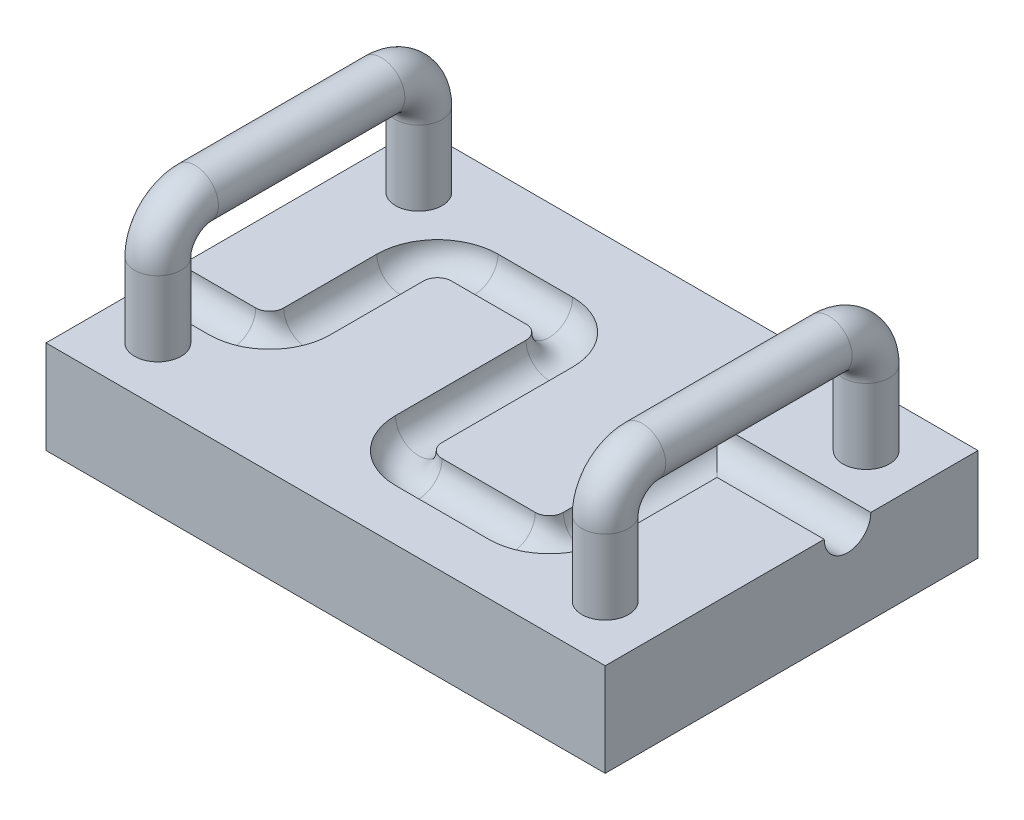
ISO-10303-21;
HEADER;
FILE_DESCRIPTION(('STEP AP214'),'2;1');
FILE_NAME('part.step','',(''),(''),'','','');
FILE_SCHEMA(('AUTOMOTIVE_DESIGN { 1 0 10303 214 1 1 1 1 }'));
ENDSEC;
DATA;
#1=APPLICATION_CONTEXT('core data for automotive mechanical design processes');
#2=APPLICATION_PROTOCOL_DEFINITION('international standard','automotive_design',2000,#1);
#3=PRODUCT_CONTEXT('',#1,'mechanical');
#4=PRODUCT('Part','Part','',(#3));
#5=PRODUCT_RELATED_PRODUCT_CATEGORY('part','',(#4));
#6=PRODUCT_DEFINITION_FORMATION('','',#4);
#7=PRODUCT_DEFINITION_CONTEXT('part definition',#1,'design');
#8=PRODUCT_DEFINITION('design','',#6,#7);
#9=PRODUCT_DEFINITION_SHAPE('','',#8);
#10=(LENGTH_UNIT() NAMED_UNIT(*) SI_UNIT(.MILLI.,.METRE.));
#11=(NAMED_UNIT(*) PLANE_ANGLE_UNIT() SI_UNIT($,.RADIAN.));
#12=(NAMED_UNIT(*) SI_UNIT($,.STERADIAN.) SOLID_ANGLE_UNIT());
#13=UNCERTAINTY_MEASURE_WITH_UNIT(LENGTH_MEASURE(1.E-05),#10,'distance_accuracy_value','');
#14=(GEOMETRIC_REPRESENTATION_CONTEXT(3) GLOBAL_UNCERTAINTY_ASSIGNED_CONTEXT((#13)) GLOBAL_UNIT_ASSIGNED_CONTEXT((#10,
#11,#12)) REPRESENTATION_CONTEXT('',''));
#15=CARTESIAN_POINT('',(0.,0.,0.));
#16=DIRECTION('',(0.,0.,1.));
#17=DIRECTION('',(1.,0.,0.));
#18=AXIS2_PLACEMENT_3D('',#15,#16,#17);
#19=CARTESIAN_POINT('',(0.,0.,0.));
#20=DIRECTION('',(0.,1.,0.));
#21=DIRECTION('',(0.,0.,1.));
#22=AXIS2_PLACEMENT_3D('',#19,#20,#21);
#23=PLANE('',#22);
#24=CARTESIAN_POINT('',(120.,0.,70.));
#25=DIRECTION('',(0.,-1.,0.));
#26=DIRECTION('',(0.,0.,1.));
#27=AXIS2_PLACEMENT_3D('',#24,#25,#26);
#28=CIRCLE('',#27,12.5);
#29=CARTESIAN_POINT('',(120.,0.,82.5));
#30=VERTEX_POINT('',#29);
#31=EDGE_CURVE('E653',#30,#30,#28,.F.);
#32=ORIENTED_EDGE('',*,*,#31,.F.);
#33=EDGE_LOOP('',(#32));
#34=FACE_BOUND('',#33,.T.);
#35=CARTESIAN_POINT('',(-120.,0.,70.));
#36=DIRECTION('',(0.,1.,0.));
#37=DIRECTION('',(0.,0.,1.));
#38=AXIS2_PLACEMENT_3D('',#35,#36,#37);
#39=CIRCLE('',#38,12.5);
#40=CARTESIAN_POINT('',(-120.,0.,82.5));
#41=VERTEX_POINT('',#40);
#42=EDGE_CURVE('E309',#41,#41,#39,.T.);
#43=ORIENTED_EDGE('',*,*,#42,.F.);
#44=EDGE_LOOP('',(#43));
#45=FACE_BOUND('',#44,.T.);
#46=CARTESIAN_POINT('',(-110.,0.,20.0000000000001));
#47=DIRECTION('',(0.,1.,0.));
#48=DIRECTION('',(0.,0.,1.));
#49=AXIS2_PLACEMENT_3D('',#46,#47,#48);
#50=CIRCLE('',#49,32.4999999999988);
#51=CARTESIAN_POINT('',(-77.5,0.,19.9999999999998));
#52=VERTEX_POINT('',#51);
#53=CARTESIAN_POINT('',(-110.,0.,52.4999999999995));
#54=VERTEX_POINT('',#53);
#55=EDGE_CURVE('E211',#52,#54,#50,.F.);
#56=ORIENTED_EDGE('',*,*,#55,.T.);
#57=DIRECTION('',(1.,0.,0.));
#58=VECTOR('',#57,1.);
#59=CARTESIAN_POINT('',(-151.,0.,52.5000000000001));
#60=LINE('',#59,#58);
#61=CARTESIAN_POINT('',(-150.,0.,52.5000000000001));
#62=VERTEX_POINT('',#61);
#63=EDGE_CURVE('E12',#54,#62,#60,.F.);
#64=ORIENTED_EDGE('',*,*,#63,.T.);
#65=DIRECTION('',(0.,0.,1.));
#66=VECTOR('',#65,1.);
#67=CARTESIAN_POINT('',(-150.,0.,100.));
#68=LINE('',#67,#66);
#69=CARTESIAN_POINT('',(-150.,0.,100.));
#70=VERTEX_POINT('',#69);
#71=EDGE_CURVE('E204',#62,#70,#68,.T.);
#72=ORIENTED_EDGE('',*,*,#71,.T.);
#73=DIRECTION('',(1.,0.,0.));
#74=VECTOR('',#73,1.);
#75=CARTESIAN_POINT('',(150.,0.,100.));
#76=LINE('',#75,#74);
#77=CARTESIAN_POINT('',(150.,0.,100.));
#78=VERTEX_POINT('',#77);
#79=EDGE_CURVE('E214',#70,#78,#76,.T.);
#80=ORIENTED_EDGE('',*,*,#79,.T.);
#81=DIRECTION('',(0.,0.,-1.));
#82=VECTOR('',#81,1.);
#83=CARTESIAN_POINT('',(150.,0.,100.));
#84=LINE('',#83,#82);
#85=CARTESIAN_POINT('',(150.,0.,-17.4999999999999));
#86=VERTEX_POINT('',#85);
#87=EDGE_CURVE('E221',#78,#86,#84,.T.);
#88=ORIENTED_EDGE('',*,*,#87,.T.);
#89=DIRECTION('',(1.,0.,0.));
#90=VECTOR('',#89,1.);
#91=CARTESIAN_POINT('',(66.15,0.,-17.4999999999999));
#92=LINE('',#91,#90);
#93=CARTESIAN_POINT('',(92.5,0.,-17.4999999999999));
#94=VERTEX_POINT('',#93);
#95=EDGE_CURVE('E76',#86,#94,#92,.F.);
#96=ORIENTED_EDGE('',*,*,#95,.T.);
#97=DIRECTION('',(0.,0.,-1.));
#98=VECTOR('',#97,1.);
#99=CARTESIAN_POINT('',(92.5,0.,39.9999999999999));
#100=LINE('',#99,#98);
#101=CARTESIAN_POINT('',(92.5,0.,39.9999999999999));
#102=VERTEX_POINT('',#101);
#103=EDGE_CURVE('E269',#94,#102,#100,.F.);
#104=ORIENTED_EDGE('',*,*,#103,.T.);
#105=CARTESIAN_POINT('',(60.,0.,40.0000000000001));
#106=DIRECTION('',(0.,1.,0.));
#107=DIRECTION('',(0.,0.,1.));
#108=AXIS2_PLACEMENT_3D('',#105,#106,#107);
#109=CIRCLE('',#108,32.499999999999);
#110=CARTESIAN_POINT('',(59.9999999999999,0.,72.4999999999996));
#111=VERTEX_POINT('',#110);
#112=EDGE_CURVE('E272',#102,#111,#109,.F.);
#113=ORIENTED_EDGE('',*,*,#112,.T.);
#114=DIRECTION('',(1.,0.,0.));
#115=VECTOR('',#114,1.);
#116=CARTESIAN_POINT('',(10.,0.,72.5000000000001));
#117=LINE('',#116,#115);
#118=CARTESIAN_POINT('',(10.,0.,72.5000000000001));
#119=VERTEX_POINT('',#118);
#120=EDGE_CURVE('E275',#111,#119,#117,.F.);
#121=ORIENTED_EDGE('',*,*,#120,.T.);
#122=CARTESIAN_POINT('',(10.,0.,40.));
#123=DIRECTION('',(0.,1.,0.));
#124=DIRECTION('',(0.,0.,1.));
#125=AXIS2_PLACEMENT_3D('',#122,#123,#124);
#126=CIRCLE('',#125,32.5);
#127=CARTESIAN_POINT('',(-22.5,0.,39.9999999999999));
#128=VERTEX_POINT('',#127);
#129=EDGE_CURVE('E278',#119,#128,#126,.F.);
#130=ORIENTED_EDGE('',*,*,#129,.T.);
#131=DIRECTION('',(0.,0.,1.));
#132=VECTOR('',#131,1.);
#133=CARTESIAN_POINT('',(-22.5,0.,-29.9999999999998));
#134=LINE('',#133,#132);
#135=CARTESIAN_POINT('',(-22.5,0.,-29.9999999999999));
#136=VERTEX_POINT('',#135);
#137=EDGE_CURVE('E281',#128,#136,#134,.F.);
#138=ORIENTED_EDGE('',*,*,#137,.T.);
#139=CARTESIAN_POINT('',(-30.,0.,-29.9999999999999));
#140=DIRECTION('',(0.,-1.,0.));
#141=DIRECTION('',(0.,0.,-1.));
#142=AXIS2_PLACEMENT_3D('',#139,#140,#141);
#143=CIRCLE('',#142,7.4999999999989);
#144=CARTESIAN_POINT('',(-30.0000000000001,0.,-37.4999999999999));
#145=VERTEX_POINT('',#144);
#146=EDGE_CURVE('E284',#136,#145,#143,.F.);
#147=ORIENTED_EDGE('',*,*,#146,.T.);
#148=DIRECTION('',(1.,0.,0.));
#149=VECTOR('',#148,1.);
#150=CARTESIAN_POINT('',(-70.,0.,-37.4999999999999));
#151=LINE('',#150,#149);
#152=CARTESIAN_POINT('',(-70.,0.,-37.4999999999999));
#153=VERTEX_POINT('',#152);
#154=EDGE_CURVE('E287',#145,#153,#151,.F.);
#155=ORIENTED_EDGE('',*,*,#154,.T.);
#156=CARTESIAN_POINT('',(-70.,0.,-30.));
#157=DIRECTION('',(0.,-1.,0.));
#158=DIRECTION('',(0.,0.,-1.));
#159=AXIS2_PLACEMENT_3D('',#156,#157,#158);
#160=CIRCLE('',#159,7.5);
#161=CARTESIAN_POINT('',(-77.5,0.,-29.9999999999998));
#162=VERTEX_POINT('',#161);
#163=EDGE_CURVE('E290',#153,#162,#160,.F.);
#164=ORIENTED_EDGE('',*,*,#163,.T.);
#165=DIRECTION('',(0.,0.,-1.));
#166=VECTOR('',#165,1.);
#167=CARTESIAN_POINT('',(-77.5,0.,19.9999999999999));
#168=LINE('',#167,#166);
#169=EDGE_CURVE('E293',#162,#52,#168,.F.);
#170=ORIENTED_EDGE('',*,*,#169,.T.);
#171=EDGE_LOOP('',(#56,#64,#72,#80,#88,#96,#104,#113,#121,#130,#138,#147,#155,#164,#170));
#172=FACE_BOUND('',#171,.T.);
#173=ADVANCED_FACE('F68',(#34,#45,#172),#23,.T.);
#174=CARTESIAN_POINT('',(120.,0.,-70.));
#175=DIRECTION('',(0.,1.,0.));
#176=DIRECTION('',(0.,0.,-1.));
#177=AXIS2_PLACEMENT_3D('',#174,#175,#176);
#178=CIRCLE('',#177,12.5);
#179=CARTESIAN_POINT('',(120.,0.,-82.5));
#180=VERTEX_POINT('',#179);
#181=EDGE_CURVE('E667',#180,#180,#178,.F.);
#182=ORIENTED_EDGE('',*,*,#181,.T.);
#183=EDGE_LOOP('',(#182));
#184=FACE_BOUND('',#183,.T.);
#185=CARTESIAN_POINT('',(-120.,0.,-70.));
#186=DIRECTION('',(0.,-1.,0.));
#187=DIRECTION('',(0.,0.,-1.));
#188=AXIS2_PLACEMENT_3D('',#185,#186,#187);
#189=CIRCLE('',#188,12.5);
#190=CARTESIAN_POINT('',(-120.,0.,-82.5));
#191=VERTEX_POINT('',#190);
#192=EDGE_CURVE('E650',#191,#191,#189,.T.);
#193=ORIENTED_EDGE('',*,*,#192,.T.);
#194=EDGE_LOOP('',(#193));
#195=FACE_BOUND('',#194,.T.);
#196=CARTESIAN_POINT('',(-150.,0.,-100.));
#197=VERTEX_POINT('',#196);
#198=CARTESIAN_POINT('',(-150.,0.,27.5000000000001));
#199=VERTEX_POINT('',#198);
#200=EDGE_CURVE('E212',#197,#199,#68,.T.);
#201=ORIENTED_EDGE('',*,*,#200,.T.);
#202=DIRECTION('',(1.,0.,0.));
#203=VECTOR('',#202,1.);
#204=CARTESIAN_POINT('',(-151.,0.,27.5000000000001));
#205=LINE('',#204,#203);
#206=CARTESIAN_POINT('',(-110.,0.,27.5000000000001));
#207=VERTEX_POINT('',#206);
#208=EDGE_CURVE('E201',#199,#207,#205,.T.);
#209=ORIENTED_EDGE('',*,*,#208,.T.);
#210=CARTESIAN_POINT('',(-110.,0.,20.0000000000001));
#211=DIRECTION('',(0.,-1.,0.));
#212=DIRECTION('',(0.,0.,-1.));
#213=AXIS2_PLACEMENT_3D('',#210,#211,#212);
#214=CIRCLE('',#213,7.49999999999878);
#215=CARTESIAN_POINT('',(-102.5,0.,20.));
#216=VERTEX_POINT('',#215);
#217=EDGE_CURVE('E262',#207,#216,#214,.F.);
#218=ORIENTED_EDGE('',*,*,#217,.T.);
#219=DIRECTION('',(0.,0.,-1.));
#220=VECTOR('',#219,1.);
#221=CARTESIAN_POINT('',(-102.5,0.,19.9999999999999));
#222=LINE('',#221,#220);
#223=CARTESIAN_POINT('',(-102.5,0.,-29.9999999999998));
#224=VERTEX_POINT('',#223);
#225=EDGE_CURVE('E259',#216,#224,#222,.T.);
#226=ORIENTED_EDGE('',*,*,#225,.T.);
#227=CARTESIAN_POINT('',(-70.,0.,-30.));
#228=DIRECTION('',(0.,1.,0.));
#229=DIRECTION('',(0.,0.,1.));
#230=AXIS2_PLACEMENT_3D('',#227,#228,#229);
#231=CIRCLE('',#230,32.5);
#232=CARTESIAN_POINT('',(-70.,0.,-62.4999999999999));
#233=VERTEX_POINT('',#232);
#234=EDGE_CURVE('E256',#224,#233,#231,.F.);
#235=ORIENTED_EDGE('',*,*,#234,.T.);
#236=DIRECTION('',(1.,0.,0.));
#237=VECTOR('',#236,1.);
#238=CARTESIAN_POINT('',(-70.,0.,-62.4999999999999));
#239=LINE('',#238,#237);
#240=CARTESIAN_POINT('',(-30.0000000000001,0.,-62.4999999999994));
#241=VERTEX_POINT('',#240);
#242=EDGE_CURVE('E253',#233,#241,#239,.T.);
#243=ORIENTED_EDGE('',*,*,#242,.T.);
#244=CARTESIAN_POINT('',(-30.,0.,-29.9999999999999));
#245=DIRECTION('',(0.,1.,0.));
#246=DIRECTION('',(0.,0.,1.));
#247=AXIS2_PLACEMENT_3D('',#244,#245,#246);
#248=CIRCLE('',#247,32.4999999999989);
#249=CARTESIAN_POINT('',(2.5,0.,-29.9999999999997));
#250=VERTEX_POINT('',#249);
#251=EDGE_CURVE('E250',#241,#250,#248,.F.);
#252=ORIENTED_EDGE('',*,*,#251,.T.);
#253=DIRECTION('',(0.,0.,1.));
#254=VECTOR('',#253,1.);
#255=CARTESIAN_POINT('',(2.50000000000001,0.,-29.9999999999998));
#256=LINE('',#255,#254);
#257=CARTESIAN_POINT('',(2.50000000000001,0.,39.9999999999999));
#258=VERTEX_POINT('',#257);
#259=EDGE_CURVE('E247',#250,#258,#256,.T.);
#260=ORIENTED_EDGE('',*,*,#259,.T.);
#261=CARTESIAN_POINT('',(10.,0.,40.));
#262=DIRECTION('',(0.,-1.,0.));
#263=DIRECTION('',(0.,0.,-1.));
#264=AXIS2_PLACEMENT_3D('',#261,#262,#263);
#265=CIRCLE('',#264,7.5);
#266=CARTESIAN_POINT('',(10.,0.,47.5000000000001));
#267=VERTEX_POINT('',#266);
#268=EDGE_CURVE('E244',#258,#267,#265,.F.);
#269=ORIENTED_EDGE('',*,*,#268,.T.);
#270=DIRECTION('',(1.,0.,0.));
#271=VECTOR('',#270,1.);
#272=CARTESIAN_POINT('',(10.,0.,47.5000000000001));
#273=LINE('',#272,#271);
#274=CARTESIAN_POINT('',(59.9999999999999,0.,47.5000000000001));
#275=VERTEX_POINT('',#274);
#276=EDGE_CURVE('E241',#267,#275,#273,.T.);
#277=ORIENTED_EDGE('',*,*,#276,.T.);
#278=CARTESIAN_POINT('',(60.,0.,40.0000000000001));
#279=DIRECTION('',(0.,-1.,0.));
#280=DIRECTION('',(0.,0.,-1.));
#281=AXIS2_PLACEMENT_3D('',#278,#279,#280);
#282=CIRCLE('',#281,7.49999999999898);
#283=CARTESIAN_POINT('',(67.5,0.,40.));
#284=VERTEX_POINT('',#283);
#285=EDGE_CURVE('E238',#275,#284,#282,.F.);
#286=ORIENTED_EDGE('',*,*,#285,.T.);
#287=DIRECTION('',(0.,0.,-1.));
#288=VECTOR('',#287,1.);
#289=CARTESIAN_POINT('',(67.5,0.,39.9999999999999));
#290=LINE('',#289,#288);
#291=CARTESIAN_POINT('',(67.5,0.,-42.5));
#292=VERTEX_POINT('',#291);
#293=EDGE_CURVE('E229',#284,#292,#290,.T.);
#294=ORIENTED_EDGE('',*,*,#293,.T.);
#295=DIRECTION('',(1.,0.,0.));
#296=VECTOR('',#295,1.);
#297=CARTESIAN_POINT('',(66.15,0.,-42.5));
#298=LINE('',#297,#296);
#299=CARTESIAN_POINT('',(150.,0.,-42.4999999999999));
#300=VERTEX_POINT('',#299);
#301=EDGE_CURVE('E265',#292,#300,#298,.T.);
#302=ORIENTED_EDGE('',*,*,#301,.T.);
#303=CARTESIAN_POINT('',(150.,0.,-100.));
#304=VERTEX_POINT('',#303);
#305=EDGE_CURVE('E220',#300,#304,#84,.T.);
#306=ORIENTED_EDGE('',*,*,#305,.T.);
#307=DIRECTION('',(-1.,0.,0.));
#308=VECTOR('',#307,1.);
#309=CARTESIAN_POINT('',(150.,0.,-100.));
#310=LINE('',#309,#308);
#311=EDGE_CURVE('E224',#304,#197,#310,.T.);
#312=ORIENTED_EDGE('',*,*,#311,.T.);
#313=EDGE_LOOP('',(#201,#209,#218,#226,#235,#243,#252,#260,#269,#277,#286,#294,#302,#306,#312));
#314=FACE_BOUND('',#313,.T.);
#315=ADVANCED_FACE('F356',(#184,#195,#314),#23,.T.);
#316=CARTESIAN_POINT('',(-150.,-50.,100.));
#317=DIRECTION('',(-1.,0.,0.));
#318=DIRECTION('',(0.,0.,1.));
#319=AXIS2_PLACEMENT_3D('',#316,#317,#318);
#320=PLANE('',#319);
#321=ORIENTED_EDGE('',*,*,#71,.F.);
#322=CARTESIAN_POINT('',(-150.,0.,40.0000000000001));
#323=DIRECTION('',(-1.,0.,0.));
#324=DIRECTION('',(0.,0.,1.));
#325=AXIS2_PLACEMENT_3D('',#322,#323,#324);
#326=CIRCLE('',#325,12.5);
#327=EDGE_CURVE('E196',#199,#62,#326,.T.);
#328=ORIENTED_EDGE('',*,*,#327,.F.);
#329=ORIENTED_EDGE('',*,*,#200,.F.);
#330=DIRECTION('',(0.,1.,0.));
#331=VECTOR('',#330,1.);
#332=CARTESIAN_POINT('',(-150.,-50.,-100.));
#333=LINE('',#332,#331);
#334=CARTESIAN_POINT('',(-150.,-50.,-100.));
#335=VERTEX_POINT('',#334);
#336=EDGE_CURVE('E92',#335,#197,#333,.T.);
#337=ORIENTED_EDGE('',*,*,#336,.F.);
#338=DIRECTION('',(0.,0.,1.));
#339=VECTOR('',#338,1.);
#340=CARTESIAN_POINT('',(-150.,-50.,100.));
#341=LINE('',#340,#339);
#342=CARTESIAN_POINT('',(-150.,-50.,100.));
#343=VERTEX_POINT('',#342);
#344=EDGE_CURVE('E227',#335,#343,#341,.T.);
#345=ORIENTED_EDGE('',*,*,#344,.T.);
#346=DIRECTION('',(0.,1.,0.));
#347=VECTOR('',#346,1.);
#348=CARTESIAN_POINT('',(-150.,-50.,100.));
#349=LINE('',#348,#347);
#350=EDGE_CURVE('E119',#343,#70,#349,.T.);
#351=ORIENTED_EDGE('',*,*,#350,.T.);
#352=EDGE_LOOP('',(#321,#328,#329,#337,#345,#351));
#353=FACE_BOUND('',#352,.T.);
#354=ADVANCED_FACE('F70',(#353),#320,.T.);
#355=CARTESIAN_POINT('',(150.,-50.,-100.));
#356=DIRECTION('',(0.,0.,-1.));
#357=DIRECTION('',(-1.,0.,0.));
#358=AXIS2_PLACEMENT_3D('',#355,#356,#357);
#359=PLANE('',#358);
#360=ORIENTED_EDGE('',*,*,#311,.F.);
#361=DIRECTION('',(0.,1.,0.));
#362=VECTOR('',#361,1.);
#363=CARTESIAN_POINT('',(150.,-50.,-100.));
#364=LINE('',#363,#362);
#365=CARTESIAN_POINT('',(150.,-50.,-100.));
#366=VERTEX_POINT('',#365);
#367=EDGE_CURVE('E230',#366,#304,#364,.T.);
#368=ORIENTED_EDGE('',*,*,#367,.F.);
#369=DIRECTION('',(-1.,0.,0.));
#370=VECTOR('',#369,1.);
#371=CARTESIAN_POINT('',(150.,-50.,-100.));
#372=LINE('',#371,#370);
#373=EDGE_CURVE('E217',#366,#335,#372,.T.);
#374=ORIENTED_EDGE('',*,*,#373,.T.);
#375=ORIENTED_EDGE('',*,*,#336,.T.);
#376=EDGE_LOOP('',(#360,#368,#374,#375));
#377=FACE_BOUND('',#376,.T.);
#378=ADVANCED_FACE('F344',(#377),#359,.T.);
#379=CARTESIAN_POINT('',(150.,-50.,100.));
#380=DIRECTION('',(1.,0.,0.));
#381=DIRECTION('',(0.,0.,-1.));
#382=AXIS2_PLACEMENT_3D('',#379,#380,#381);
#383=PLANE('',#382);
#384=ORIENTED_EDGE('',*,*,#305,.F.);
#385=CARTESIAN_POINT('',(150.,0.,-29.9999999999999));
#386=DIRECTION('',(1.,0.,0.));
#387=DIRECTION('',(0.,0.,-1.));
#388=AXIS2_PLACEMENT_3D('',#385,#386,#387);
#389=CIRCLE('',#388,12.5);
#390=EDGE_CURVE('E205',#86,#300,#389,.T.);
#391=ORIENTED_EDGE('',*,*,#390,.F.);
#392=ORIENTED_EDGE('',*,*,#87,.F.);
#393=DIRECTION('',(0.,1.,0.));
#394=VECTOR('',#393,1.);
#395=CARTESIAN_POINT('',(150.,-50.,100.));
#396=LINE('',#395,#394);
#397=CARTESIAN_POINT('',(150.,-50.,100.));
#398=VERTEX_POINT('',#397);
#399=EDGE_CURVE('E233',#398,#78,#396,.T.);
#400=ORIENTED_EDGE('',*,*,#399,.F.);
#401=DIRECTION('',(0.,0.,-1.));
#402=VECTOR('',#401,1.);
#403=CARTESIAN_POINT('',(150.,-50.,100.));
#404=LINE('',#403,#402);
#405=EDGE_CURVE('E340',#398,#366,#404,.T.);
#406=ORIENTED_EDGE('',*,*,#405,.T.);
#407=ORIENTED_EDGE('',*,*,#367,.T.);
#408=EDGE_LOOP('',(#384,#391,#392,#400,#406,#407));
#409=FACE_BOUND('',#408,.T.);
#410=ADVANCED_FACE('F302',(#409),#383,.T.);
#411=CARTESIAN_POINT('',(150.,-50.,100.));
#412=DIRECTION('',(0.,0.,1.));
#413=DIRECTION('',(1.,0.,0.));
#414=AXIS2_PLACEMENT_3D('',#411,#412,#413);
#415=PLANE('',#414);
#416=ORIENTED_EDGE('',*,*,#79,.F.);
#417=ORIENTED_EDGE('',*,*,#350,.F.);
#418=DIRECTION('',(1.,0.,0.));
#419=VECTOR('',#418,1.);
#420=CARTESIAN_POINT('',(150.,-50.,100.));
#421=LINE('',#420,#419);
#422=EDGE_CURVE('E339',#343,#398,#421,.T.);
#423=ORIENTED_EDGE('',*,*,#422,.T.);
#424=ORIENTED_EDGE('',*,*,#399,.T.);
#425=EDGE_LOOP('',(#416,#417,#423,#424));
#426=FACE_BOUND('',#425,.T.);
#427=ADVANCED_FACE('F347',(#426),#415,.T.);
#428=CARTESIAN_POINT('',(0.,-50.,0.));
#429=DIRECTION('',(0.,1.,0.));
#430=DIRECTION('',(0.,0.,1.));
#431=AXIS2_PLACEMENT_3D('',#428,#429,#430);
#432=PLANE('',#431);
#433=ORIENTED_EDGE('',*,*,#344,.F.);
#434=ORIENTED_EDGE('',*,*,#373,.F.);
#435=ORIENTED_EDGE('',*,*,#405,.F.);
#436=ORIENTED_EDGE('',*,*,#422,.F.);
#437=EDGE_LOOP('',(#433,#434,#435,#436));
#438=FACE_BOUND('',#437,.T.);
#439=ADVANCED_FACE('F346',(#438),#432,.F.);
#440=CARTESIAN_POINT('',(-151.,0.,40.0000000000001));
#441=DIRECTION('',(1.,0.,0.));
#442=DIRECTION('',(0.,0.,-1.));
#443=AXIS2_PLACEMENT_3D('',#440,#441,#442);
#444=CYLINDRICAL_SURFACE('',#443,12.5);
#445=CARTESIAN_POINT('',(-110.,0.,40.0000000000001));
#446=DIRECTION('',(-1.,0.,0.));
#447=DIRECTION('',(0.,0.,1.));
#448=AXIS2_PLACEMENT_3D('',#445,#446,#447);
#449=CIRCLE('',#448,12.5);
#450=EDGE_CURVE('E335',#207,#54,#449,.T.);
#451=ORIENTED_EDGE('',*,*,#450,.F.);
#452=ORIENTED_EDGE('',*,*,#208,.F.);
#453=ORIENTED_EDGE('',*,*,#327,.T.);
#454=ORIENTED_EDGE('',*,*,#63,.F.);
#455=EDGE_LOOP('',(#451,#452,#453,#454));
#456=FACE_BOUND('',#455,.T.);
#457=ADVANCED_FACE('F198',(#456),#444,.F.);
#458=CARTESIAN_POINT('',(66.15,0.,-29.9999999999999));
#459=DIRECTION('',(1.,0.,0.));
#460=DIRECTION('',(0.,0.,-1.));
#461=AXIS2_PLACEMENT_3D('',#458,#459,#460);
#462=CYLINDRICAL_SURFACE('',#461,12.5);
#463=ORIENTED_EDGE('',*,*,#390,.T.);
#464=ORIENTED_EDGE('',*,*,#301,.F.);
#465=CARTESIAN_POINT('',(80.,0.,-29.9999999999999));
#466=DIRECTION('',(0.707106781186548,0.,-0.707106781186547));
#467=DIRECTION('',(-0.707106781186547,0.,-0.707106781186548));
#468=AXIS2_PLACEMENT_3D('',#465,#466,#467);
#469=ELLIPSE('',#468,17.6776695296637,12.5);
#470=EDGE_CURVE('E83',#94,#292,#469,.T.);
#471=ORIENTED_EDGE('',*,*,#470,.F.);
#472=ORIENTED_EDGE('',*,*,#95,.F.);
#473=EDGE_LOOP('',(#463,#464,#471,#472));
#474=FACE_BOUND('',#473,.T.);
#475=ADVANCED_FACE('F299',(#474),#462,.F.);
#476=CARTESIAN_POINT('',(-110.,0.,20.0000000000001));
#477=DIRECTION('',(0.,1.,0.));
#478=DIRECTION('',(0.,0.,1.));
#479=AXIS2_PLACEMENT_3D('',#476,#477,#478);
#480=TOROIDAL_SURFACE('',#479,19.9999999999988,12.5);
#481=CARTESIAN_POINT('',(-90.,0.,19.9999999999999));
#482=DIRECTION('',(0.,0.,1.));
#483=DIRECTION('',(1.,0.,0.));
#484=AXIS2_PLACEMENT_3D('',#481,#482,#483);
#485=CIRCLE('',#484,12.5);
#486=EDGE_CURVE('E332',#216,#52,#485,.T.);
#487=ORIENTED_EDGE('',*,*,#486,.F.);
#488=ORIENTED_EDGE('',*,*,#217,.F.);
#489=ORIENTED_EDGE('',*,*,#450,.T.);
#490=ORIENTED_EDGE('',*,*,#55,.F.);
#491=EDGE_LOOP('',(#487,#488,#489,#490));
#492=FACE_BOUND('',#491,.T.);
#493=ADVANCED_FACE('F469',(#492),#480,.F.);
#494=CARTESIAN_POINT('',(-90.,0.,19.9999999999999));
#495=DIRECTION('',(0.,0.,-1.));
#496=DIRECTION('',(-1.,0.,0.));
#497=AXIS2_PLACEMENT_3D('',#494,#495,#496);
#498=CYLINDRICAL_SURFACE('',#497,12.5);
#499=CARTESIAN_POINT('',(-90.,0.,-29.9999999999998));
#500=DIRECTION('',(0.,0.,1.));
#501=DIRECTION('',(1.,0.,0.));
#502=AXIS2_PLACEMENT_3D('',#499,#500,#501);
#503=CIRCLE('',#502,12.5);
#504=EDGE_CURVE('E329',#224,#162,#503,.T.);
#505=ORIENTED_EDGE('',*,*,#504,.F.);
#506=ORIENTED_EDGE('',*,*,#225,.F.);
#507=ORIENTED_EDGE('',*,*,#486,.T.);
#508=ORIENTED_EDGE('',*,*,#169,.F.);
#509=EDGE_LOOP('',(#505,#506,#507,#508));
#510=FACE_BOUND('',#509,.T.);
#511=ADVANCED_FACE('F498',(#510),#498,.F.);
#512=CARTESIAN_POINT('',(-70.,0.,-30.));
#513=DIRECTION('',(0.,-1.,0.));
#514=DIRECTION('',(0.,0.,-1.));
#515=AXIS2_PLACEMENT_3D('',#512,#513,#514);
#516=TOROIDAL_SURFACE('',#515,20.,12.5);
#517=ORIENTED_EDGE('',*,*,#504,.T.);
#518=ORIENTED_EDGE('',*,*,#163,.F.);
#519=CARTESIAN_POINT('',(-70.,0.,-49.9999999999999));
#520=DIRECTION('',(-1.,0.,0.));
#521=DIRECTION('',(0.,0.,1.));
#522=AXIS2_PLACEMENT_3D('',#519,#520,#521);
#523=CIRCLE('',#522,12.5);
#524=EDGE_CURVE('E326',#233,#153,#523,.T.);
#525=ORIENTED_EDGE('',*,*,#524,.F.);
#526=ORIENTED_EDGE('',*,*,#234,.F.);
#527=EDGE_LOOP('',(#517,#518,#525,#526));
#528=FACE_BOUND('',#527,.T.);
#529=ADVANCED_FACE('F494',(#528),#516,.F.);
#530=CARTESIAN_POINT('',(-70.,0.,-49.9999999999999));
#531=DIRECTION('',(1.,0.,0.));
#532=DIRECTION('',(0.,0.,-1.));
#533=AXIS2_PLACEMENT_3D('',#530,#531,#532);
#534=CYLINDRICAL_SURFACE('',#533,12.5);
#535=CARTESIAN_POINT('',(-30.0000000000001,0.,-49.9999999999999));
#536=DIRECTION('',(-1.,0.,0.));
#537=DIRECTION('',(0.,0.,1.));
#538=AXIS2_PLACEMENT_3D('',#535,#536,#537);
#539=CIRCLE('',#538,12.5);
#540=EDGE_CURVE('E323',#241,#145,#539,.T.);
#541=ORIENTED_EDGE('',*,*,#540,.F.);
#542=ORIENTED_EDGE('',*,*,#242,.F.);
#543=ORIENTED_EDGE('',*,*,#524,.T.);
#544=ORIENTED_EDGE('',*,*,#154,.F.);
#545=EDGE_LOOP('',(#541,#542,#543,#544));
#546=FACE_BOUND('',#545,.T.);
#547=ADVANCED_FACE('F490',(#546),#534,.F.);
#548=CARTESIAN_POINT('',(-30.,0.,-29.9999999999999));
#549=DIRECTION('',(0.,-1.,0.));
#550=DIRECTION('',(0.,0.,-1.));
#551=AXIS2_PLACEMENT_3D('',#548,#549,#550);
#552=TOROIDAL_SURFACE('',#551,19.9999999999989,12.5);
#553=ORIENTED_EDGE('',*,*,#540,.T.);
#554=ORIENTED_EDGE('',*,*,#146,.F.);
#555=CARTESIAN_POINT('',(-10.,0.,-29.9999999999998));
#556=DIRECTION('',(0.,0.,-1.));
#557=DIRECTION('',(-1.,0.,0.));
#558=AXIS2_PLACEMENT_3D('',#555,#556,#557);
#559=CIRCLE('',#558,12.5);
#560=EDGE_CURVE('E320',#250,#136,#559,.T.);
#561=ORIENTED_EDGE('',*,*,#560,.F.);
#562=ORIENTED_EDGE('',*,*,#251,.F.);
#563=EDGE_LOOP('',(#553,#554,#561,#562));
#564=FACE_BOUND('',#563,.T.);
#565=ADVANCED_FACE('F486',(#564),#552,.F.);
#566=CARTESIAN_POINT('',(-9.99999999999999,0.,-29.9999999999998));
#567=DIRECTION('',(0.,0.,1.));
#568=DIRECTION('',(1.,0.,0.));
#569=AXIS2_PLACEMENT_3D('',#566,#567,#568);
#570=CYLINDRICAL_SURFACE('',#569,12.5);
#571=CARTESIAN_POINT('',(-9.99999999999999,0.,39.9999999999999));
#572=DIRECTION('',(0.,0.,-1.));
#573=DIRECTION('',(-1.,0.,0.));
#574=AXIS2_PLACEMENT_3D('',#571,#572,#573);
#575=CIRCLE('',#574,12.5);
#576=EDGE_CURVE('E317',#258,#128,#575,.T.);
#577=ORIENTED_EDGE('',*,*,#576,.F.);
#578=ORIENTED_EDGE('',*,*,#259,.F.);
#579=ORIENTED_EDGE('',*,*,#560,.T.);
#580=ORIENTED_EDGE('',*,*,#137,.F.);
#581=EDGE_LOOP('',(#577,#578,#579,#580));
#582=FACE_BOUND('',#581,.T.);
#583=ADVANCED_FACE('F482',(#582),#570,.F.);
#584=CARTESIAN_POINT('',(10.,0.,40.));
#585=DIRECTION('',(0.,1.,0.));
#586=DIRECTION('',(0.,0.,1.));
#587=AXIS2_PLACEMENT_3D('',#584,#585,#586);
#588=TOROIDAL_SURFACE('',#587,20.,12.5);
#589=CARTESIAN_POINT('',(10.,0.,60.0000000000001));
#590=DIRECTION('',(-1.,0.,0.));
#591=DIRECTION('',(0.,0.,1.));
#592=AXIS2_PLACEMENT_3D('',#589,#590,#591);
#593=CIRCLE('',#592,12.5);
#594=EDGE_CURVE('E314',#267,#119,#593,.T.);
#595=ORIENTED_EDGE('',*,*,#594,.F.);
#596=ORIENTED_EDGE('',*,*,#268,.F.);
#597=ORIENTED_EDGE('',*,*,#576,.T.);
#598=ORIENTED_EDGE('',*,*,#129,.F.);
#599=EDGE_LOOP('',(#595,#596,#597,#598));
#600=FACE_BOUND('',#599,.T.);
#601=ADVANCED_FACE('F478',(#600),#588,.F.);
#602=CARTESIAN_POINT('',(10.,0.,60.0000000000001));
#603=DIRECTION('',(1.,0.,0.));
#604=DIRECTION('',(0.,0.,-1.));
#605=AXIS2_PLACEMENT_3D('',#602,#603,#604);
#606=CYLINDRICAL_SURFACE('',#605,12.5);
#607=CARTESIAN_POINT('',(59.9999999999999,0.,60.0000000000001));
#608=DIRECTION('',(-1.,0.,0.));
#609=DIRECTION('',(0.,0.,1.));
#610=AXIS2_PLACEMENT_3D('',#607,#608,#609);
#611=CIRCLE('',#610,12.5);
#612=EDGE_CURVE('E306',#275,#111,#611,.T.);
#613=ORIENTED_EDGE('',*,*,#612,.F.);
#614=ORIENTED_EDGE('',*,*,#276,.F.);
#615=ORIENTED_EDGE('',*,*,#594,.T.);
#616=ORIENTED_EDGE('',*,*,#120,.F.);
#617=EDGE_LOOP('',(#613,#614,#615,#616));
#618=FACE_BOUND('',#617,.T.);
#619=ADVANCED_FACE('F474',(#618),#606,.F.);
#620=CARTESIAN_POINT('',(60.,0.,40.0000000000001));
#621=DIRECTION('',(0.,1.,0.));
#622=DIRECTION('',(0.,0.,1.));
#623=AXIS2_PLACEMENT_3D('',#620,#621,#622);
#624=TOROIDAL_SURFACE('',#623,19.999999999999,12.5);
#625=CARTESIAN_POINT('',(80.,0.,40.));
#626=DIRECTION('',(0.,0.,1.));
#627=DIRECTION('',(1.,0.,0.));
#628=AXIS2_PLACEMENT_3D('',#625,#626,#627);
#629=CIRCLE('',#628,12.5);
#630=EDGE_CURVE('E303',#284,#102,#629,.T.);
#631=ORIENTED_EDGE('',*,*,#630,.F.);
#632=ORIENTED_EDGE('',*,*,#285,.F.);
#633=ORIENTED_EDGE('',*,*,#612,.T.);
#634=ORIENTED_EDGE('',*,*,#112,.F.);
#635=EDGE_LOOP('',(#631,#632,#633,#634));
#636=FACE_BOUND('',#635,.T.);
#637=ADVANCED_FACE('F455',(#636),#624,.F.);
#638=CARTESIAN_POINT('',(80.,0.,39.9999999999999));
#639=DIRECTION('',(0.,0.,-1.));
#640=DIRECTION('',(-1.,0.,0.));
#641=AXIS2_PLACEMENT_3D('',#638,#639,#640);
#642=CYLINDRICAL_SURFACE('',#641,12.5);
#643=ORIENTED_EDGE('',*,*,#470,.T.);
#644=ORIENTED_EDGE('',*,*,#293,.F.);
#645=ORIENTED_EDGE('',*,*,#630,.T.);
#646=ORIENTED_EDGE('',*,*,#103,.F.);
#647=EDGE_LOOP('',(#643,#644,#645,#646));
#648=FACE_BOUND('',#647,.T.);
#649=ADVANCED_FACE('F446',(#648),#642,.F.);
#650=CARTESIAN_POINT('',(-120.,0.,-70.));
#651=DIRECTION('',(0.,1.,0.));
#652=DIRECTION('',(0.,0.,1.));
#653=AXIS2_PLACEMENT_3D('',#650,#651,#652);
#654=CYLINDRICAL_SURFACE('',#653,12.5);
#655=CARTESIAN_POINT('',(-120.,39.9999999999998,-70.));
#656=DIRECTION('',(0.,-1.,0.));
#657=DIRECTION('',(0.,0.,-1.));
#658=AXIS2_PLACEMENT_3D('',#655,#656,#657);
#659=CIRCLE('',#658,12.5);
#660=CARTESIAN_POINT('',(-120.,39.9999999999997,-82.5));
#661=VERTEX_POINT('',#660);
#662=EDGE_CURVE('E648',#661,#661,#659,.T.);
#663=ORIENTED_EDGE('',*,*,#662,.T.);
#664=EDGE_LOOP('',(#663));
#665=FACE_BOUND('',#664,.T.);
#666=ORIENTED_EDGE('',*,*,#192,.F.);
#667=EDGE_LOOP('',(#666));
#668=FACE_BOUND('',#667,.T.);
#669=ADVANCED_FACE('F437',(#665,#668),#654,.T.);
#670=CARTESIAN_POINT('',(-120.,40.,-50.));
#671=DIRECTION('',(1.,0.,0.));
#672=DIRECTION('',(0.,0.,-1.));
#673=AXIS2_PLACEMENT_3D('',#670,#671,#672);
#674=TOROIDAL_SURFACE('',#673,20.,12.5);
#675=CARTESIAN_POINT('',(-120.,60.,-49.9999999999999));
#676=DIRECTION('',(0.,0.,-1.));
#677=DIRECTION('',(0.,1.,0.));
#678=AXIS2_PLACEMENT_3D('',#675,#676,#677);
#679=CIRCLE('',#678,12.5);
#680=CARTESIAN_POINT('',(-120.,72.5,-49.9999999999998));
#681=VERTEX_POINT('',#680);
#682=EDGE_CURVE('E643',#681,#681,#679,.T.);
#683=CARTESIAN_POINT('',(-120.,40.,-50.));
#684=DIRECTION('',(1.,0.,0.));
#685=DIRECTION('',(0.,0.,-1.));
#686=AXIS2_PLACEMENT_3D('',#683,#684,#685);
#687=CIRCLE('',#686,32.5);
#688=EDGE_CURVE('',#661,#681,#687,.T.);
#689=ORIENTED_EDGE('',*,*,#662,.F.);
#690=ORIENTED_EDGE('',*,*,#682,.T.);
#691=ORIENTED_EDGE('',*,*,#688,.T.);
#692=ORIENTED_EDGE('',*,*,#688,.F.);
#693=EDGE_LOOP('',(#689,#691,#690,#692));
#694=FACE_BOUND('',#693,.T.);
#695=ADVANCED_FACE('F445',(#694),#674,.T.);
#696=CARTESIAN_POINT('',(-120.,60.,-49.9999999999999));
#697=DIRECTION('',(0.,0.,1.));
#698=DIRECTION('',(1.,0.,0.));
#699=AXIS2_PLACEMENT_3D('',#696,#697,#698);
#700=CYLINDRICAL_SURFACE('',#699,12.5);
#701=CARTESIAN_POINT('',(-120.,60.,49.9999999999999));
#702=DIRECTION('',(0.,0.,-1.));
#703=DIRECTION('',(0.,1.,0.));
#704=AXIS2_PLACEMENT_3D('',#701,#702,#703);
#705=CIRCLE('',#704,12.5);
#706=CARTESIAN_POINT('',(-120.,72.5,49.9999999999998));
#707=VERTEX_POINT('',#706);
#708=EDGE_CURVE('E641',#707,#707,#705,.T.);
#709=ORIENTED_EDGE('',*,*,#708,.T.);
#710=EDGE_LOOP('',(#709));
#711=FACE_BOUND('',#710,.T.);
#712=ORIENTED_EDGE('',*,*,#682,.F.);
#713=EDGE_LOOP('',(#712));
#714=FACE_BOUND('',#713,.T.);
#715=ADVANCED_FACE('F452',(#711,#714),#700,.T.);
#716=CARTESIAN_POINT('',(-120.,40.,50.));
#717=DIRECTION('',(1.,0.,0.));
#718=DIRECTION('',(0.,0.,-1.));
#719=AXIS2_PLACEMENT_3D('',#716,#717,#718);
#720=TOROIDAL_SURFACE('',#719,20.,12.5);
#721=CARTESIAN_POINT('',(-120.,40.0000000000003,70.));
#722=DIRECTION('',(0.,1.,0.));
#723=DIRECTION('',(0.,0.,1.));
#724=AXIS2_PLACEMENT_3D('',#721,#722,#723);
#725=CIRCLE('',#724,12.5);
#726=CARTESIAN_POINT('',(-120.,40.0000000000006,82.5));
#727=VERTEX_POINT('',#726);
#728=EDGE_CURVE('E640',#727,#727,#725,.T.);
#729=CARTESIAN_POINT('',(-120.,40.,50.));
#730=DIRECTION('',(1.,0.,0.));
#731=DIRECTION('',(0.,0.,-1.));
#732=AXIS2_PLACEMENT_3D('',#729,#730,#731);
#733=CIRCLE('',#732,32.5);
#734=EDGE_CURVE('',#707,#727,#733,.T.);
#735=ORIENTED_EDGE('',*,*,#708,.F.);
#736=ORIENTED_EDGE('',*,*,#728,.T.);
#737=ORIENTED_EDGE('',*,*,#734,.T.);
#738=ORIENTED_EDGE('',*,*,#734,.F.);
#739=EDGE_LOOP('',(#735,#737,#736,#738));
#740=FACE_BOUND('',#739,.T.);
#741=ADVANCED_FACE('F462',(#740),#720,.T.);
#742=CARTESIAN_POINT('',(-120.,39.9999999999999,70.));
#743=DIRECTION('',(0.,-1.,0.));
#744=DIRECTION('',(0.,0.,-1.));
#745=AXIS2_PLACEMENT_3D('',#742,#743,#744);
#746=CYLINDRICAL_SURFACE('',#745,12.5);
#747=ORIENTED_EDGE('',*,*,#42,.T.);
#748=EDGE_LOOP('',(#747));
#749=FACE_BOUND('',#748,.T.);
#750=ORIENTED_EDGE('',*,*,#728,.F.);
#751=EDGE_LOOP('',(#750));
#752=FACE_BOUND('',#751,.T.);
#753=ADVANCED_FACE('F394',(#749,#752),#746,.T.);
#754=CARTESIAN_POINT('',(120.,0.,-70.));
#755=DIRECTION('',(0.,1.,0.));
#756=DIRECTION('',(0.,0.,1.));
#757=AXIS2_PLACEMENT_3D('',#754,#755,#756);
#758=CYLINDRICAL_SURFACE('',#757,12.5);
#759=CARTESIAN_POINT('',(120.,39.9999999999998,-70.));
#760=DIRECTION('',(0.,1.,0.));
#761=DIRECTION('',(0.,0.,-1.));
#762=AXIS2_PLACEMENT_3D('',#759,#760,#761);
#763=CIRCLE('',#762,12.5);
#764=CARTESIAN_POINT('',(120.,39.9999999999997,-82.5));
#765=VERTEX_POINT('',#764);
#766=EDGE_CURVE('E664',#765,#765,#763,.F.);
#767=ORIENTED_EDGE('',*,*,#766,.T.);
#768=EDGE_LOOP('',(#767));
#769=FACE_BOUND('',#768,.T.);
#770=ORIENTED_EDGE('',*,*,#181,.F.);
#771=EDGE_LOOP('',(#770));
#772=FACE_BOUND('',#771,.T.);
#773=ADVANCED_FACE('F388',(#769,#772),#758,.T.);
#774=CARTESIAN_POINT('',(120.,40.,-50.));
#775=DIRECTION('',(1.,0.,0.));
#776=DIRECTION('',(0.,0.,-1.));
#777=AXIS2_PLACEMENT_3D('',#774,#775,#776);
#778=TOROIDAL_SURFACE('',#777,20.,12.5);
#779=CARTESIAN_POINT('',(120.,60.,-49.9999999999999));
#780=DIRECTION('',(0.,0.,1.));
#781=DIRECTION('',(0.,1.,0.));
#782=AXIS2_PLACEMENT_3D('',#779,#780,#781);
#783=CIRCLE('',#782,12.5);
#784=CARTESIAN_POINT('',(120.,72.5,-49.9999999999998));
#785=VERTEX_POINT('',#784);
#786=EDGE_CURVE('E661',#785,#785,#783,.F.);
#787=CARTESIAN_POINT('',(120.,40.,-50.));
#788=DIRECTION('',(1.,0.,0.));
#789=DIRECTION('',(0.,0.,-1.));
#790=AXIS2_PLACEMENT_3D('',#787,#788,#789);
#791=CIRCLE('',#790,32.5);
#792=EDGE_CURVE('',#765,#785,#791,.T.);
#793=ORIENTED_EDGE('',*,*,#766,.F.);
#794=ORIENTED_EDGE('',*,*,#786,.T.);
#795=ORIENTED_EDGE('',*,*,#792,.T.);
#796=ORIENTED_EDGE('',*,*,#792,.F.);
#797=EDGE_LOOP('',(#793,#795,#794,#796));
#798=FACE_BOUND('',#797,.T.);
#799=ADVANCED_FACE('F393',(#798),#778,.T.);
#800=CARTESIAN_POINT('',(120.,60.,-49.9999999999999));
#801=DIRECTION('',(0.,0.,1.));
#802=DIRECTION('',(1.,0.,0.));
#803=AXIS2_PLACEMENT_3D('',#800,#801,#802);
#804=CYLINDRICAL_SURFACE('',#803,12.5);
#805=CARTESIAN_POINT('',(120.,60.,49.9999999999999));
#806=DIRECTION('',(0.,0.,1.));
#807=DIRECTION('',(0.,1.,0.));
#808=AXIS2_PLACEMENT_3D('',#805,#806,#807);
#809=CIRCLE('',#808,12.5);
#810=CARTESIAN_POINT('',(120.,72.5,49.9999999999998));
#811=VERTEX_POINT('',#810);
#812=EDGE_CURVE('E658',#811,#811,#809,.F.);
#813=ORIENTED_EDGE('',*,*,#812,.T.);
#814=EDGE_LOOP('',(#813));
#815=FACE_BOUND('',#814,.T.);
#816=ORIENTED_EDGE('',*,*,#786,.F.);
#817=EDGE_LOOP('',(#816));
#818=FACE_BOUND('',#817,.T.);
#819=ADVANCED_FACE('F406',(#815,#818),#804,.T.);
#820=CARTESIAN_POINT('',(120.,40.,50.));
#821=DIRECTION('',(1.,0.,0.));
#822=DIRECTION('',(0.,0.,-1.));
#823=AXIS2_PLACEMENT_3D('',#820,#821,#822);
#824=TOROIDAL_SURFACE('',#823,20.,12.5);
#825=CARTESIAN_POINT('',(120.,40.0000000000003,70.));
#826=DIRECTION('',(0.,-1.,0.));
#827=DIRECTION('',(0.,0.,1.));
#828=AXIS2_PLACEMENT_3D('',#825,#826,#827);
#829=CIRCLE('',#828,12.5);
#830=CARTESIAN_POINT('',(120.,40.0000000000006,82.5));
#831=VERTEX_POINT('',#830);
#832=EDGE_CURVE('E655',#831,#831,#829,.F.);
#833=CARTESIAN_POINT('',(120.,40.,50.));
#834=DIRECTION('',(1.,0.,0.));
#835=DIRECTION('',(0.,0.,-1.));
#836=AXIS2_PLACEMENT_3D('',#833,#834,#835);
#837=CIRCLE('',#836,32.5);
#838=EDGE_CURVE('',#811,#831,#837,.T.);
#839=ORIENTED_EDGE('',*,*,#812,.F.);
#840=ORIENTED_EDGE('',*,*,#832,.T.);
#841=ORIENTED_EDGE('',*,*,#838,.T.);
#842=ORIENTED_EDGE('',*,*,#838,.F.);
#843=EDGE_LOOP('',(#839,#841,#840,#842));
#844=FACE_BOUND('',#843,.T.);
#845=ADVANCED_FACE('F416',(#844),#824,.T.);
#846=CARTESIAN_POINT('',(120.,39.9999999999999,70.));
#847=DIRECTION('',(0.,-1.,0.));
#848=DIRECTION('',(0.,0.,-1.));
#849=AXIS2_PLACEMENT_3D('',#846,#847,#848);
#850=CYLINDRICAL_SURFACE('',#849,12.5);
#851=ORIENTED_EDGE('',*,*,#31,.T.);
#852=EDGE_LOOP('',(#851));
#853=FACE_BOUND('',#852,.T.);
#854=ORIENTED_EDGE('',*,*,#832,.F.);
#855=EDGE_LOOP('',(#854));
#856=FACE_BOUND('',#855,.T.);
#857=ADVANCED_FACE('F426',(#853,#856),#850,.T.);
#858=CLOSED_SHELL('',(#173,#315,#354,#378,#410,#427,#439,#457,#475,#493,#511,#529,#547,#565,
#583,#601,#619,#637,#649,#669,#695,#715,#741,#753,#773,#799,#819,#845,#857));
#859=MANIFOLD_SOLID_BREP('B2',#858);
#860=ADVANCED_BREP_SHAPE_REPRESENTATION('',(#18,#859),#14);
#861=SHAPE_DEFINITION_REPRESENTATION(#9,#860);
ENDSEC;
END-ISO-10303-21;
